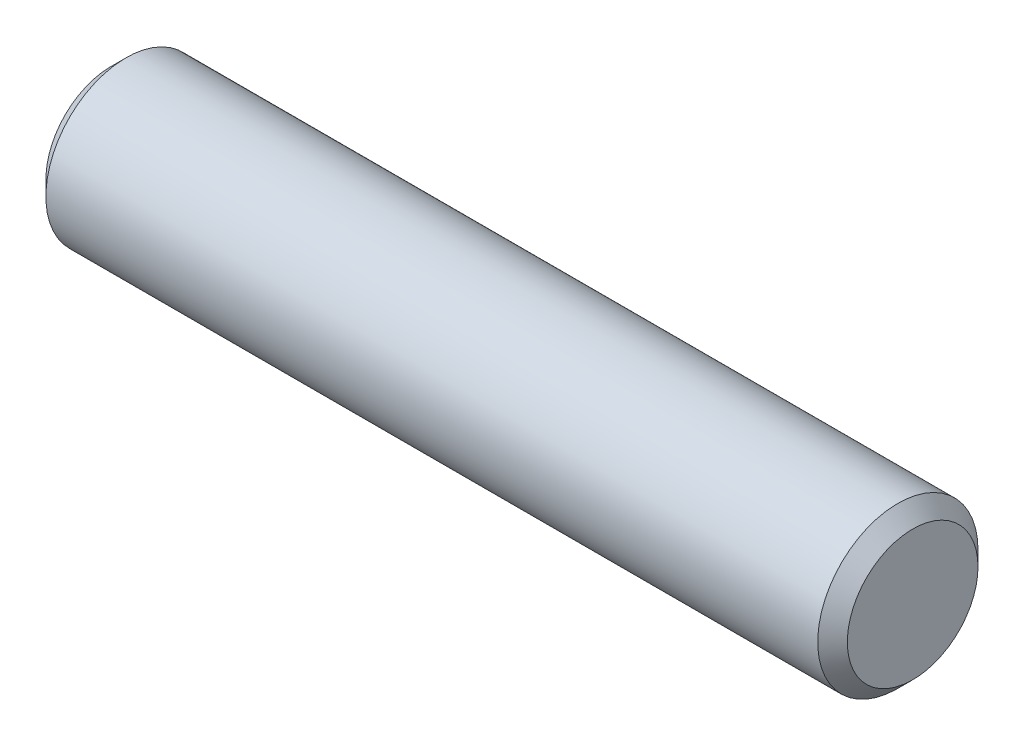
ISO-10303-21;
HEADER;
FILE_DESCRIPTION(('STEP AP214'),'2;1');
FILE_NAME('part.step','',(''),(''),'','','');
FILE_SCHEMA(('AUTOMOTIVE_DESIGN { 1 0 10303 214 1 1 1 1 }'));
ENDSEC;
DATA;
#1=APPLICATION_CONTEXT('core data for automotive mechanical design processes');
#2=APPLICATION_PROTOCOL_DEFINITION('international standard','automotive_design',2000,#1);
#3=PRODUCT_CONTEXT('',#1,'mechanical');
#4=PRODUCT('Part','Part','',(#3));
#5=PRODUCT_RELATED_PRODUCT_CATEGORY('part','',(#4));
#6=PRODUCT_DEFINITION_FORMATION('','',#4);
#7=PRODUCT_DEFINITION_CONTEXT('part definition',#1,'design');
#8=PRODUCT_DEFINITION('design','',#6,#7);
#9=PRODUCT_DEFINITION_SHAPE('','',#8);
#10=(LENGTH_UNIT() NAMED_UNIT(*) SI_UNIT(.MILLI.,.METRE.));
#11=(NAMED_UNIT(*) PLANE_ANGLE_UNIT() SI_UNIT($,.RADIAN.));
#12=(NAMED_UNIT(*) SI_UNIT($,.STERADIAN.) SOLID_ANGLE_UNIT());
#13=UNCERTAINTY_MEASURE_WITH_UNIT(LENGTH_MEASURE(1.E-05),#10,'distance_accuracy_value','');
#14=(GEOMETRIC_REPRESENTATION_CONTEXT(3) GLOBAL_UNCERTAINTY_ASSIGNED_CONTEXT((#13)) GLOBAL_UNIT_ASSIGNED_CONTEXT((#10,
#11,#12)) REPRESENTATION_CONTEXT('',''));
#15=CARTESIAN_POINT('',(0.,0.,0.));
#16=DIRECTION('',(0.,0.,1.));
#17=DIRECTION('',(1.,0.,0.));
#18=AXIS2_PLACEMENT_3D('',#15,#16,#17);
#19=CARTESIAN_POINT('',(0.,3.,0.));
#20=DIRECTION('',(1.,0.,0.));
#21=DIRECTION('',(0.,0.,-1.));
#22=AXIS2_PLACEMENT_3D('',#19,#20,#21);
#23=PLANE('',#22);
#24=CARTESIAN_POINT('',(0.,0.,0.));
#25=DIRECTION('',(1.,0.,0.));
#26=DIRECTION('',(0.,0.,-1.));
#27=AXIS2_PLACEMENT_3D('',#24,#25,#26);
#28=CIRCLE('',#27,2.4455);
#29=CARTESIAN_POINT('',(0.,0.,-2.4455));
#30=VERTEX_POINT('',#29);
#31=EDGE_CURVE('E52',#30,#30,#28,.F.);
#32=ORIENTED_EDGE('',*,*,#31,.T.);
#33=EDGE_LOOP('',(#32));
#34=FACE_BOUND('',#33,.T.);
#35=ADVANCED_FACE('F37',(#34),#23,.F.);
#36=CARTESIAN_POINT('',(-3.175,0.,0.));
#37=DIRECTION('',(-1.,0.,0.));
#38=DIRECTION('',(0.,0.,1.));
#39=AXIS2_PLACEMENT_3D('',#36,#37,#38);
#40=CYLINDRICAL_SURFACE('',#39,3.);
#41=CARTESIAN_POINT('',(0.554500000000001,0.,0.));
#42=DIRECTION('',(1.,0.,0.));
#43=DIRECTION('',(0.,0.,-1.));
#44=AXIS2_PLACEMENT_3D('',#41,#42,#43);
#45=CIRCLE('',#44,3.);
#46=CARTESIAN_POINT('',(0.554500000000001,0.,-3.));
#47=VERTEX_POINT('',#46);
#48=EDGE_CURVE('E44',#47,#47,#45,.T.);
#49=ORIENTED_EDGE('',*,*,#48,.T.);
#50=EDGE_LOOP('',(#49));
#51=FACE_BOUND('',#50,.T.);
#52=CARTESIAN_POINT('',(29.4455,0.,0.));
#53=DIRECTION('',(1.,0.,0.));
#54=DIRECTION('',(0.,0.,-1.));
#55=AXIS2_PLACEMENT_3D('',#52,#53,#54);
#56=CIRCLE('',#55,3.);
#57=CARTESIAN_POINT('',(29.4455,0.,-3.));
#58=VERTEX_POINT('',#57);
#59=EDGE_CURVE('E48',#58,#58,#56,.F.);
#60=ORIENTED_EDGE('',*,*,#59,.T.);
#61=EDGE_LOOP('',(#60));
#62=FACE_BOUND('',#61,.T.);
#63=ADVANCED_FACE('F68',(#51,#62),#40,.T.);
#64=CARTESIAN_POINT('',(30.,3.,0.));
#65=DIRECTION('',(1.,0.,0.));
#66=DIRECTION('',(0.,0.,-1.));
#67=AXIS2_PLACEMENT_3D('',#64,#65,#66);
#68=PLANE('',#67);
#69=CARTESIAN_POINT('',(30.,0.,0.));
#70=DIRECTION('',(1.,0.,0.));
#71=DIRECTION('',(0.,0.,-1.));
#72=AXIS2_PLACEMENT_3D('',#69,#70,#71);
#73=CIRCLE('',#72,2.4455);
#74=CARTESIAN_POINT('',(30.,0.,-2.4455));
#75=VERTEX_POINT('',#74);
#76=EDGE_CURVE('E10',#75,#75,#73,.T.);
#77=ORIENTED_EDGE('',*,*,#76,.T.);
#78=EDGE_LOOP('',(#77));
#79=FACE_BOUND('',#78,.T.);
#80=ADVANCED_FACE('F61',(#79),#68,.T.);
#81=CARTESIAN_POINT('',(0.,0.,0.));
#82=DIRECTION('',(1.,0.,0.));
#83=DIRECTION('',(0.,0.,-1.));
#84=AXIS2_PLACEMENT_3D('',#81,#82,#83);
#85=CONICAL_SURFACE('',#84,2.4455,0.785398163397447);
#86=ORIENTED_EDGE('',*,*,#48,.F.);
#87=EDGE_LOOP('',(#86));
#88=FACE_BOUND('',#87,.T.);
#89=ORIENTED_EDGE('',*,*,#31,.F.);
#90=EDGE_LOOP('',(#89));
#91=FACE_BOUND('',#90,.T.);
#92=ADVANCED_FACE('F59',(#88,#91),#85,.T.);
#93=CARTESIAN_POINT('',(29.4455,0.,0.));
#94=DIRECTION('',(-1.,0.,0.));
#95=DIRECTION('',(0.,0.,1.));
#96=AXIS2_PLACEMENT_3D('',#93,#94,#95);
#97=CONICAL_SURFACE('',#96,3.,0.785398163397452);
#98=ORIENTED_EDGE('',*,*,#76,.F.);
#99=EDGE_LOOP('',(#98));
#100=FACE_BOUND('',#99,.T.);
#101=ORIENTED_EDGE('',*,*,#59,.F.);
#102=EDGE_LOOP('',(#101));
#103=FACE_BOUND('',#102,.T.);
#104=ADVANCED_FACE('F39',(#100,#103),#97,.T.);
#105=CLOSED_SHELL('',(#35,#63,#80,#92,#104));
#106=MANIFOLD_SOLID_BREP('B2',#105);
#107=ADVANCED_BREP_SHAPE_REPRESENTATION('',(#18,#106),#14);
#108=SHAPE_DEFINITION_REPRESENTATION(#9,#107);
ENDSEC;
END-ISO-10303-21;
